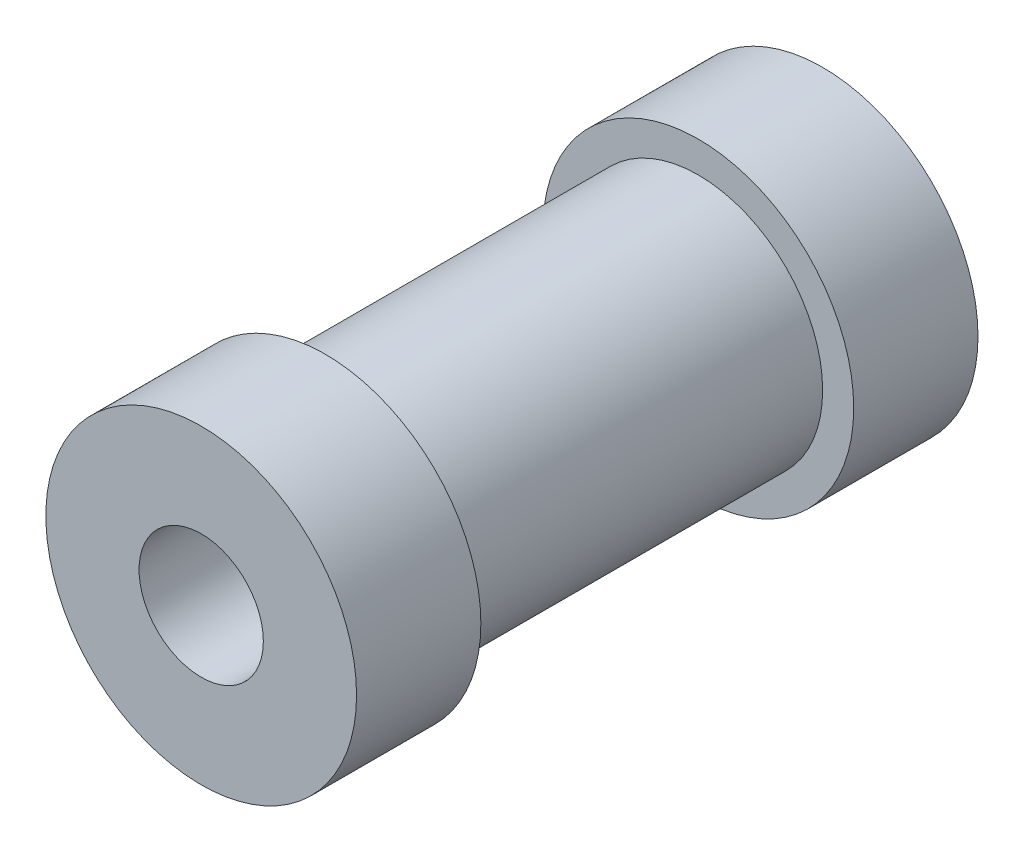
ISO-10303-21;
HEADER;
FILE_DESCRIPTION(('STEP AP214'),'2;1');
FILE_NAME('part.step','',(''),(''),'','','');
FILE_SCHEMA(('AUTOMOTIVE_DESIGN { 1 0 10303 214 1 1 1 1 }'));
ENDSEC;
DATA;
#1=APPLICATION_CONTEXT('core data for automotive mechanical design processes');
#2=APPLICATION_PROTOCOL_DEFINITION('international standard','automotive_design',2000,#1);
#3=PRODUCT_CONTEXT('',#1,'mechanical');
#4=PRODUCT('Part','Part','',(#3));
#5=PRODUCT_RELATED_PRODUCT_CATEGORY('part','',(#4));
#6=PRODUCT_DEFINITION_FORMATION('','',#4);
#7=PRODUCT_DEFINITION_CONTEXT('part definition',#1,'design');
#8=PRODUCT_DEFINITION('design','',#6,#7);
#9=PRODUCT_DEFINITION_SHAPE('','',#8);
#10=(LENGTH_UNIT() NAMED_UNIT(*) SI_UNIT(.MILLI.,.METRE.));
#11=(NAMED_UNIT(*) PLANE_ANGLE_UNIT() SI_UNIT($,.RADIAN.));
#12=(NAMED_UNIT(*) SI_UNIT($,.STERADIAN.) SOLID_ANGLE_UNIT());
#13=UNCERTAINTY_MEASURE_WITH_UNIT(LENGTH_MEASURE(1.E-05),#10,'distance_accuracy_value','');
#14=(GEOMETRIC_REPRESENTATION_CONTEXT(3) GLOBAL_UNCERTAINTY_ASSIGNED_CONTEXT((#13)) GLOBAL_UNIT_ASSIGNED_CONTEXT((#10,
#11,#12)) REPRESENTATION_CONTEXT('',''));
#15=CARTESIAN_POINT('',(0.,0.,0.));
#16=DIRECTION('',(0.,0.,1.));
#17=DIRECTION('',(1.,0.,0.));
#18=AXIS2_PLACEMENT_3D('',#15,#16,#17);
#19=CARTESIAN_POINT('',(0.,0.,1.5));
#20=DIRECTION('',(0.,0.,-1.));
#21=DIRECTION('',(-1.,0.,0.));
#22=AXIS2_PLACEMENT_3D('',#19,#20,#21);
#23=CYLINDRICAL_SURFACE('',#22,1.);
#24=CARTESIAN_POINT('',(0.,0.,1.5));
#25=DIRECTION('',(0.,0.,1.));
#26=DIRECTION('',(1.,0.,0.));
#27=AXIS2_PLACEMENT_3D('',#24,#25,#26);
#28=CIRCLE('',#27,1.);
#29=CARTESIAN_POINT('',(1.,0.,1.5));
#30=VERTEX_POINT('',#29);
#31=EDGE_CURVE('E10',#30,#30,#28,.T.);
#32=ORIENTED_EDGE('',*,*,#31,.F.);
#33=EDGE_LOOP('',(#32));
#34=FACE_BOUND('',#33,.T.);
#35=CARTESIAN_POINT('',(0.,0.,-1.5));
#36=DIRECTION('',(0.,0.,1.));
#37=DIRECTION('',(1.,0.,0.));
#38=AXIS2_PLACEMENT_3D('',#35,#36,#37);
#39=CIRCLE('',#38,1.);
#40=CARTESIAN_POINT('',(1.,0.,-1.5));
#41=VERTEX_POINT('',#40);
#42=EDGE_CURVE('E40',#41,#41,#39,.T.);
#43=ORIENTED_EDGE('',*,*,#42,.T.);
#44=EDGE_LOOP('',(#43));
#45=FACE_BOUND('',#44,.T.);
#46=ADVANCED_FACE('F37',(#34,#45),#23,.T.);
#47=CARTESIAN_POINT('',(0.,0.,2.5));
#48=DIRECTION('',(0.,0.,-1.));
#49=DIRECTION('',(-1.,0.,0.));
#50=AXIS2_PLACEMENT_3D('',#47,#48,#49);
#51=CYLINDRICAL_SURFACE('',#50,1.25);
#52=CARTESIAN_POINT('',(0.,0.,2.5));
#53=DIRECTION('',(0.,0.,1.));
#54=DIRECTION('',(1.,0.,0.));
#55=AXIS2_PLACEMENT_3D('',#52,#53,#54);
#56=CIRCLE('',#55,1.25);
#57=CARTESIAN_POINT('',(1.25,0.,2.5));
#58=VERTEX_POINT('',#57);
#59=EDGE_CURVE('E44',#58,#58,#56,.T.);
#60=ORIENTED_EDGE('',*,*,#59,.F.);
#61=EDGE_LOOP('',(#60));
#62=FACE_BOUND('',#61,.T.);
#63=CARTESIAN_POINT('',(0.,0.,1.5));
#64=DIRECTION('',(0.,0.,1.));
#65=DIRECTION('',(1.,0.,0.));
#66=AXIS2_PLACEMENT_3D('',#63,#64,#65);
#67=CIRCLE('',#66,1.25);
#68=CARTESIAN_POINT('',(1.25,0.,1.5));
#69=VERTEX_POINT('',#68);
#70=EDGE_CURVE('E48',#69,#69,#67,.T.);
#71=ORIENTED_EDGE('',*,*,#70,.T.);
#72=EDGE_LOOP('',(#71));
#73=FACE_BOUND('',#72,.T.);
#74=ADVANCED_FACE('F72',(#62,#73),#51,.T.);
#75=CARTESIAN_POINT('',(0.,0.,2.5));
#76=DIRECTION('',(0.,0.,1.));
#77=DIRECTION('',(1.,0.,0.));
#78=AXIS2_PLACEMENT_3D('',#75,#76,#77);
#79=PLANE('',#78);
#80=CARTESIAN_POINT('',(0.,0.,2.5));
#81=DIRECTION('',(0.,0.,1.));
#82=DIRECTION('',(1.,0.,0.));
#83=AXIS2_PLACEMENT_3D('',#80,#81,#82);
#84=CIRCLE('',#83,0.5);
#85=CARTESIAN_POINT('',(0.5,0.,2.5));
#86=VERTEX_POINT('',#85);
#87=EDGE_CURVE('E62',#86,#86,#84,.T.);
#88=ORIENTED_EDGE('',*,*,#87,.F.);
#89=EDGE_LOOP('',(#88));
#90=FACE_BOUND('',#89,.T.);
#91=ORIENTED_EDGE('',*,*,#59,.T.);
#92=EDGE_LOOP('',(#91));
#93=FACE_BOUND('',#92,.T.);
#94=ADVANCED_FACE('F68',(#90,#93),#79,.T.);
#95=CARTESIAN_POINT('',(0.,0.,1.5));
#96=DIRECTION('',(0.,0.,1.));
#97=DIRECTION('',(1.,0.,0.));
#98=AXIS2_PLACEMENT_3D('',#95,#96,#97);
#99=PLANE('',#98);
#100=ORIENTED_EDGE('',*,*,#31,.T.);
#101=EDGE_LOOP('',(#100));
#102=FACE_BOUND('',#101,.T.);
#103=ORIENTED_EDGE('',*,*,#70,.F.);
#104=EDGE_LOOP('',(#103));
#105=FACE_BOUND('',#104,.T.);
#106=ADVANCED_FACE('F71',(#102,#105),#99,.F.);
#107=CARTESIAN_POINT('',(0.,0.,-2.5));
#108=DIRECTION('',(0.,0.,1.));
#109=DIRECTION('',(1.,0.,0.));
#110=AXIS2_PLACEMENT_3D('',#107,#108,#109);
#111=CYLINDRICAL_SURFACE('',#110,1.25);
#112=CARTESIAN_POINT('',(0.,0.,-2.5));
#113=DIRECTION('',(0.,0.,1.));
#114=DIRECTION('',(1.,0.,0.));
#115=AXIS2_PLACEMENT_3D('',#112,#113,#114);
#116=CIRCLE('',#115,1.25);
#117=CARTESIAN_POINT('',(1.25,0.,-2.5));
#118=VERTEX_POINT('',#117);
#119=EDGE_CURVE('E56',#118,#118,#116,.T.);
#120=ORIENTED_EDGE('',*,*,#119,.T.);
#121=EDGE_LOOP('',(#120));
#122=FACE_BOUND('',#121,.T.);
#123=CARTESIAN_POINT('',(0.,0.,-1.5));
#124=DIRECTION('',(0.,0.,1.));
#125=DIRECTION('',(1.,0.,0.));
#126=AXIS2_PLACEMENT_3D('',#123,#124,#125);
#127=CIRCLE('',#126,1.25);
#128=CARTESIAN_POINT('',(1.25,0.,-1.5));
#129=VERTEX_POINT('',#128);
#130=EDGE_CURVE('E53',#129,#129,#127,.T.);
#131=ORIENTED_EDGE('',*,*,#130,.F.);
#132=EDGE_LOOP('',(#131));
#133=FACE_BOUND('',#132,.T.);
#134=ADVANCED_FACE('F81',(#122,#133),#111,.T.);
#135=CARTESIAN_POINT('',(0.,0.,-2.5));
#136=DIRECTION('',(0.,0.,-1.));
#137=DIRECTION('',(1.,0.,0.));
#138=AXIS2_PLACEMENT_3D('',#135,#136,#137);
#139=PLANE('',#138);
#140=CARTESIAN_POINT('',(0.,0.,-2.5));
#141=DIRECTION('',(0.,0.,1.));
#142=DIRECTION('',(1.,0.,0.));
#143=AXIS2_PLACEMENT_3D('',#140,#141,#142);
#144=CIRCLE('',#143,0.5);
#145=CARTESIAN_POINT('',(0.5,0.,-2.5));
#146=VERTEX_POINT('',#145);
#147=EDGE_CURVE('E57',#146,#146,#144,.T.);
#148=ORIENTED_EDGE('',*,*,#147,.T.);
#149=EDGE_LOOP('',(#148));
#150=FACE_BOUND('',#149,.T.);
#151=ORIENTED_EDGE('',*,*,#119,.F.);
#152=EDGE_LOOP('',(#151));
#153=FACE_BOUND('',#152,.T.);
#154=ADVANCED_FACE('F86',(#150,#153),#139,.T.);
#155=CARTESIAN_POINT('',(0.,0.,-1.5));
#156=DIRECTION('',(0.,0.,-1.));
#157=DIRECTION('',(1.,0.,0.));
#158=AXIS2_PLACEMENT_3D('',#155,#156,#157);
#159=PLANE('',#158);
#160=ORIENTED_EDGE('',*,*,#42,.F.);
#161=EDGE_LOOP('',(#160));
#162=FACE_BOUND('',#161,.T.);
#163=ORIENTED_EDGE('',*,*,#130,.T.);
#164=EDGE_LOOP('',(#163));
#165=FACE_BOUND('',#164,.T.);
#166=ADVANCED_FACE('F97',(#162,#165),#159,.F.);
#167=CARTESIAN_POINT('',(0.,0.,-2.5));
#168=DIRECTION('',(0.,0.,1.));
#169=DIRECTION('',(1.,0.,0.));
#170=AXIS2_PLACEMENT_3D('',#167,#168,#169);
#171=CYLINDRICAL_SURFACE('',#170,0.5);
#172=ORIENTED_EDGE('',*,*,#147,.F.);
#173=EDGE_LOOP('',(#172));
#174=FACE_BOUND('',#173,.T.);
#175=ORIENTED_EDGE('',*,*,#87,.T.);
#176=EDGE_LOOP('',(#175));
#177=FACE_BOUND('',#176,.T.);
#178=ADVANCED_FACE('F66',(#174,#177),#171,.F.);
#179=CLOSED_SHELL('',(#46,#74,#94,#106,#134,#154,#166,#178));
#180=MANIFOLD_SOLID_BREP('B2',#179);
#181=ADVANCED_BREP_SHAPE_REPRESENTATION('',(#18,#180),#14);
#182=SHAPE_DEFINITION_REPRESENTATION(#9,#181);
ENDSEC;
END-ISO-10303-21;
